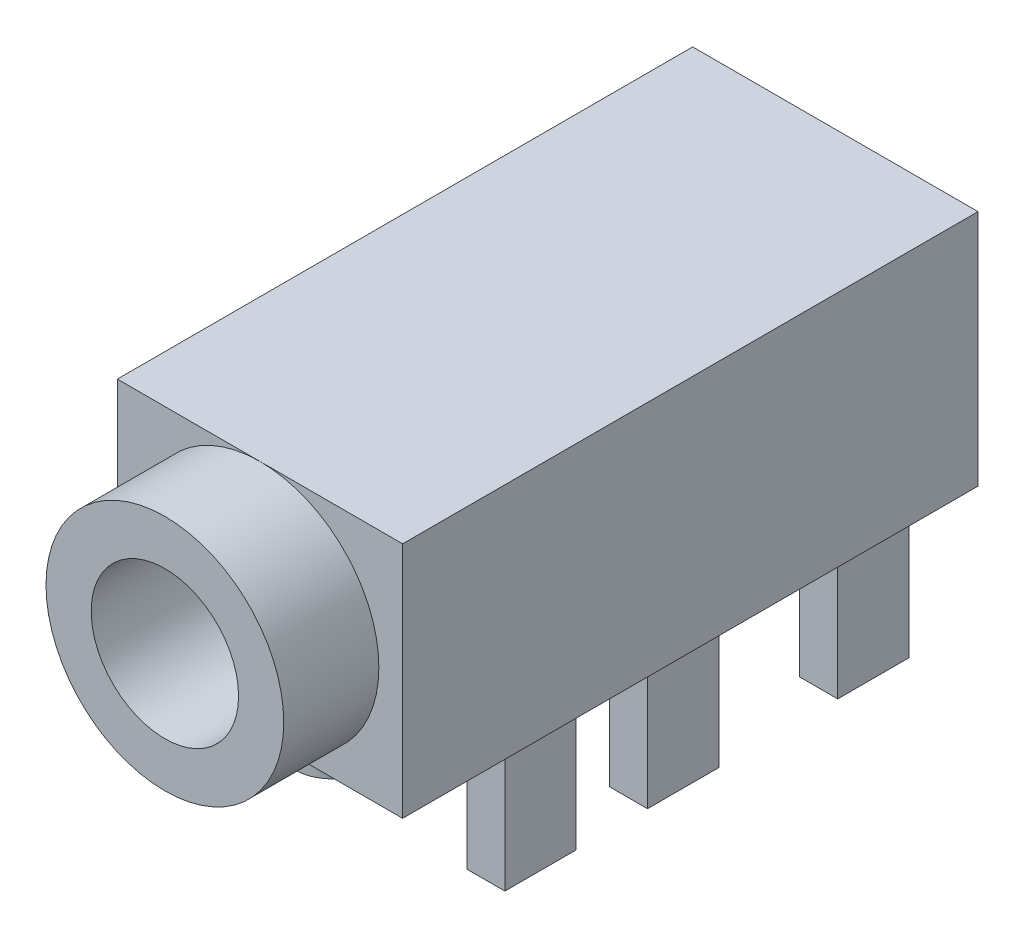
ISO-10303-21;
HEADER;
FILE_DESCRIPTION(('STEP AP214'),'2;1');
FILE_NAME('part.step','',(''),(''),'','','');
FILE_SCHEMA(('AUTOMOTIVE_DESIGN { 1 0 10303 214 1 1 1 1 }'));
ENDSEC;
DATA;
#1=APPLICATION_CONTEXT('core data for automotive mechanical design processes');
#2=APPLICATION_PROTOCOL_DEFINITION('international standard','automotive_design',2000,#1);
#3=PRODUCT_CONTEXT('',#1,'mechanical');
#4=PRODUCT('Part','Part','',(#3));
#5=PRODUCT_RELATED_PRODUCT_CATEGORY('part','',(#4));
#6=PRODUCT_DEFINITION_FORMATION('','',#4);
#7=PRODUCT_DEFINITION_CONTEXT('part definition',#1,'design');
#8=PRODUCT_DEFINITION('design','',#6,#7);
#9=PRODUCT_DEFINITION_SHAPE('','',#8);
#10=(LENGTH_UNIT() NAMED_UNIT(*) SI_UNIT(.MILLI.,.METRE.));
#11=(NAMED_UNIT(*) PLANE_ANGLE_UNIT() SI_UNIT($,.RADIAN.));
#12=(NAMED_UNIT(*) SI_UNIT($,.STERADIAN.) SOLID_ANGLE_UNIT());
#13=UNCERTAINTY_MEASURE_WITH_UNIT(LENGTH_MEASURE(1.E-05),#10,'distance_accuracy_value','');
#14=(GEOMETRIC_REPRESENTATION_CONTEXT(3) GLOBAL_UNCERTAINTY_ASSIGNED_CONTEXT((#13)) GLOBAL_UNIT_ASSIGNED_CONTEXT((#10,
#11,#12)) REPRESENTATION_CONTEXT('',''));
#15=CARTESIAN_POINT('',(0.,0.,0.));
#16=DIRECTION('',(0.,0.,1.));
#17=DIRECTION('',(1.,0.,0.));
#18=AXIS2_PLACEMENT_3D('',#15,#16,#17);
#19=CARTESIAN_POINT('',(0.,0.,0.));
#20=DIRECTION('',(0.,1.,0.));
#21=DIRECTION('',(0.,0.,1.));
#22=AXIS2_PLACEMENT_3D('',#19,#20,#21);
#23=PLANE('',#22);
#24=CARTESIAN_POINT('',(0.,0.,-2.44999999999992));
#25=DIRECTION('',(0.,1.,0.));
#26=DIRECTION('',(0.,0.,1.));
#27=AXIS2_PLACEMENT_3D('',#24,#25,#26);
#28=CIRCLE('',#27,0.75);
#29=CARTESIAN_POINT('',(0.,0.,-1.69999999999992));
#30=VERTEX_POINT('',#29);
#31=EDGE_CURVE('E11',#30,#30,#28,.F.);
#32=ORIENTED_EDGE('',*,*,#31,.F.);
#33=EDGE_LOOP('',(#32));
#34=FACE_BOUND('',#33,.T.);
#35=CARTESIAN_POINT('',(0.,0.,4.55000000000008));
#36=DIRECTION('',(0.,1.,0.));
#37=DIRECTION('',(0.,0.,1.));
#38=AXIS2_PLACEMENT_3D('',#35,#36,#37);
#39=CIRCLE('',#38,0.75);
#40=CARTESIAN_POINT('',(0.,0.,5.30000000000008));
#41=VERTEX_POINT('',#40);
#42=EDGE_CURVE('E48',#41,#41,#39,.F.);
#43=ORIENTED_EDGE('',*,*,#42,.F.);
#44=EDGE_LOOP('',(#43));
#45=FACE_BOUND('',#44,.T.);
#46=DIRECTION('',(0.,0.,-1.));
#47=VECTOR('',#46,1.);
#48=CARTESIAN_POINT('',(1.8,0.,-3.49999999999992));
#49=LINE('',#48,#47);
#50=CARTESIAN_POINT('',(1.8,0.,-3.49999999999992));
#51=VERTEX_POINT('',#50);
#52=CARTESIAN_POINT('',(1.8,0.,-4.99999999999992));
#53=VERTEX_POINT('',#52);
#54=EDGE_CURVE('E257',#51,#53,#49,.T.);
#55=ORIENTED_EDGE('',*,*,#54,.F.);
#56=DIRECTION('',(-1.,0.,0.));
#57=VECTOR('',#56,1.);
#58=CARTESIAN_POINT('',(2.6,0.,-3.49999999999992));
#59=LINE('',#58,#57);
#60=CARTESIAN_POINT('',(2.6,0.,-3.49999999999992));
#61=VERTEX_POINT('',#60);
#62=EDGE_CURVE('E273',#61,#51,#59,.T.);
#63=ORIENTED_EDGE('',*,*,#62,.F.);
#64=DIRECTION('',(0.,0.,1.));
#65=VECTOR('',#64,1.);
#66=CARTESIAN_POINT('',(2.6,0.,-3.49999999999992));
#67=LINE('',#66,#65);
#68=CARTESIAN_POINT('',(2.6,0.,-4.99999999999992));
#69=VERTEX_POINT('',#68);
#70=EDGE_CURVE('E285',#69,#61,#67,.T.);
#71=ORIENTED_EDGE('',*,*,#70,.F.);
#72=DIRECTION('',(1.,0.,0.));
#73=VECTOR('',#72,1.);
#74=CARTESIAN_POINT('',(2.6,0.,-4.99999999999992));
#75=LINE('',#74,#73);
#76=EDGE_CURVE('E69',#53,#69,#75,.T.);
#77=ORIENTED_EDGE('',*,*,#76,.F.);
#78=EDGE_LOOP('',(#55,#63,#71,#77));
#79=FACE_BOUND('',#78,.T.);
#80=DIRECTION('',(0.,0.,-1.));
#81=VECTOR('',#80,1.);
#82=CARTESIAN_POINT('',(1.8,0.,3.50000000000008));
#83=LINE('',#82,#81);
#84=CARTESIAN_POINT('',(1.8,0.,3.50000000000008));
#85=VERTEX_POINT('',#84);
#86=CARTESIAN_POINT('',(1.8,0.,2.00000000000008));
#87=VERTEX_POINT('',#86);
#88=EDGE_CURVE('E351',#85,#87,#83,.T.);
#89=ORIENTED_EDGE('',*,*,#88,.F.);
#90=DIRECTION('',(-1.,0.,0.));
#91=VECTOR('',#90,1.);
#92=CARTESIAN_POINT('',(2.6,0.,3.50000000000008));
#93=LINE('',#92,#91);
#94=CARTESIAN_POINT('',(2.6,0.,3.50000000000008));
#95=VERTEX_POINT('',#94);
#96=EDGE_CURVE('E357',#95,#85,#93,.T.);
#97=ORIENTED_EDGE('',*,*,#96,.F.);
#98=DIRECTION('',(0.,0.,1.));
#99=VECTOR('',#98,1.);
#100=CARTESIAN_POINT('',(2.6,0.,3.50000000000008));
#101=LINE('',#100,#99);
#102=CARTESIAN_POINT('',(2.6,0.,2.00000000000008));
#103=VERTEX_POINT('',#102);
#104=EDGE_CURVE('E374',#103,#95,#101,.T.);
#105=ORIENTED_EDGE('',*,*,#104,.F.);
#106=DIRECTION('',(1.,0.,0.));
#107=VECTOR('',#106,1.);
#108=CARTESIAN_POINT('',(2.6,0.,2.00000000000008));
#109=LINE('',#108,#107);
#110=EDGE_CURVE('E370',#87,#103,#109,.T.);
#111=ORIENTED_EDGE('',*,*,#110,.F.);
#112=EDGE_LOOP('',(#89,#97,#105,#111));
#113=FACE_BOUND('',#112,.T.);
#114=DIRECTION('',(0.,0.,-1.));
#115=VECTOR('',#114,1.);
#116=CARTESIAN_POINT('',(1.8,0.,0.500000000000082));
#117=LINE('',#116,#115);
#118=CARTESIAN_POINT('',(1.8,0.,0.500000000000082));
#119=VERTEX_POINT('',#118);
#120=CARTESIAN_POINT('',(1.8,0.,-0.999999999999917));
#121=VERTEX_POINT('',#120);
#122=EDGE_CURVE('E306',#119,#121,#117,.T.);
#123=ORIENTED_EDGE('',*,*,#122,.F.);
#124=DIRECTION('',(-1.,0.,0.));
#125=VECTOR('',#124,1.);
#126=CARTESIAN_POINT('',(2.6,0.,0.500000000000082));
#127=LINE('',#126,#125);
#128=CARTESIAN_POINT('',(2.6,0.,0.500000000000082));
#129=VERTEX_POINT('',#128);
#130=EDGE_CURVE('E312',#129,#119,#127,.T.);
#131=ORIENTED_EDGE('',*,*,#130,.F.);
#132=DIRECTION('',(0.,0.,1.));
#133=VECTOR('',#132,1.);
#134=CARTESIAN_POINT('',(2.6,0.,0.500000000000082));
#135=LINE('',#134,#133);
#136=CARTESIAN_POINT('',(2.6,0.,-0.999999999999917));
#137=VERTEX_POINT('',#136);
#138=EDGE_CURVE('E329',#137,#129,#135,.T.);
#139=ORIENTED_EDGE('',*,*,#138,.F.);
#140=DIRECTION('',(1.,0.,0.));
#141=VECTOR('',#140,1.);
#142=CARTESIAN_POINT('',(2.6,0.,-0.999999999999917));
#143=LINE('',#142,#141);
#144=EDGE_CURVE('E325',#121,#137,#143,.T.);
#145=ORIENTED_EDGE('',*,*,#144,.F.);
#146=EDGE_LOOP('',(#123,#131,#139,#145));
#147=FACE_BOUND('',#146,.T.);
#148=DIRECTION('',(0.,0.,-1.));
#149=VECTOR('',#148,1.);
#150=CARTESIAN_POINT('',(-2.6,0.,-4.79999999999992));
#151=LINE('',#150,#149);
#152=CARTESIAN_POINT('',(-2.6,0.,-4.79999999999992));
#153=VERTEX_POINT('',#152);
#154=CARTESIAN_POINT('',(-2.6,0.,-6.04999999999992));
#155=VERTEX_POINT('',#154);
#156=EDGE_CURVE('E58',#153,#155,#151,.T.);
#157=ORIENTED_EDGE('',*,*,#156,.F.);
#158=DIRECTION('',(-1.,0.,0.));
#159=VECTOR('',#158,1.);
#160=CARTESIAN_POINT('',(-1.8,0.,-4.79999999999992));
#161=LINE('',#160,#159);
#162=CARTESIAN_POINT('',(-1.8,0.,-4.79999999999992));
#163=VERTEX_POINT('',#162);
#164=EDGE_CURVE('E251',#163,#153,#161,.T.);
#165=ORIENTED_EDGE('',*,*,#164,.F.);
#166=DIRECTION('',(0.,0.,1.));
#167=VECTOR('',#166,1.);
#168=CARTESIAN_POINT('',(-1.8,0.,-4.79999999999992));
#169=LINE('',#168,#167);
#170=CARTESIAN_POINT('',(-1.8,0.,-6.04999999999992));
#171=VERTEX_POINT('',#170);
#172=EDGE_CURVE('E496',#171,#163,#169,.T.);
#173=ORIENTED_EDGE('',*,*,#172,.F.);
#174=DIRECTION('',(-1.,0.,0.));
#175=VECTOR('',#174,1.);
#176=CARTESIAN_POINT('',(-3.,0.,-6.04999999999992));
#177=LINE('',#176,#175);
#178=CARTESIAN_POINT('',(2.99999999999999,0.,-6.04999999999992));
#179=VERTEX_POINT('',#178);
#180=EDGE_CURVE('E426',#179,#171,#177,.T.);
#181=ORIENTED_EDGE('',*,*,#180,.F.);
#182=DIRECTION('',(0.,0.,-1.));
#183=VECTOR('',#182,1.);
#184=CARTESIAN_POINT('',(2.99999999999999,0.,-6.04999999999992));
#185=LINE('',#184,#183);
#186=CARTESIAN_POINT('',(3.,0.,6.05000000000008));
#187=VERTEX_POINT('',#186);
#188=EDGE_CURVE('E401',#187,#179,#185,.T.);
#189=ORIENTED_EDGE('',*,*,#188,.F.);
#190=DIRECTION('',(1.,0.,0.));
#191=VECTOR('',#190,1.);
#192=CARTESIAN_POINT('',(-3.,0.,6.05000000000008));
#193=LINE('',#192,#191);
#194=CARTESIAN_POINT('',(0.,0.,6.05000000000008));
#195=VERTEX_POINT('',#194);
#196=EDGE_CURVE('E434',#195,#187,#193,.T.);
#197=ORIENTED_EDGE('',*,*,#196,.F.);
#198=CARTESIAN_POINT('',(-3.,0.,6.05000000000008));
#199=VERTEX_POINT('',#198);
#200=EDGE_CURVE('E411',#199,#195,#193,.T.);
#201=ORIENTED_EDGE('',*,*,#200,.F.);
#202=DIRECTION('',(0.,0.,1.));
#203=VECTOR('',#202,1.);
#204=CARTESIAN_POINT('',(-3.,0.,-6.04999999999992));
#205=LINE('',#204,#203);
#206=CARTESIAN_POINT('',(-3.,0.,-6.04999999999992));
#207=VERTEX_POINT('',#206);
#208=EDGE_CURVE('E430',#207,#199,#205,.T.);
#209=ORIENTED_EDGE('',*,*,#208,.F.);
#210=EDGE_CURVE('E425',#155,#207,#177,.T.);
#211=ORIENTED_EDGE('',*,*,#210,.F.);
#212=EDGE_LOOP('',(#157,#165,#173,#181,#189,#197,#201,#209,#211));
#213=FACE_BOUND('',#212,.T.);
#214=ADVANCED_FACE('F39',(#34,#45,#79,#113,#147,#213),#23,.F.);
#215=CARTESIAN_POINT('',(-3.,5.,6.05000000000008));
#216=DIRECTION('',(0.,0.,-1.));
#217=DIRECTION('',(-1.,0.,0.));
#218=AXIS2_PLACEMENT_3D('',#215,#216,#217);
#219=PLANE('',#218);
#220=CARTESIAN_POINT('',(0.,2.5,6.05000000000008));
#221=DIRECTION('',(0.,0.,1.));
#222=DIRECTION('',(1.,0.,0.));
#223=AXIS2_PLACEMENT_3D('',#220,#221,#222);
#224=CIRCLE('',#223,2.5);
#225=CARTESIAN_POINT('',(0.,5.,6.05000000000008));
#226=VERTEX_POINT('',#225);
#227=EDGE_CURVE('E396',#226,#195,#224,.T.);
#228=ORIENTED_EDGE('',*,*,#227,.F.);
#229=DIRECTION('',(1.,0.,0.));
#230=VECTOR('',#229,1.);
#231=CARTESIAN_POINT('',(-3.,5.,6.05000000000008));
#232=LINE('',#231,#230);
#233=CARTESIAN_POINT('',(-3.,5.,6.05000000000008));
#234=VERTEX_POINT('',#233);
#235=EDGE_CURVE('E418',#234,#226,#232,.T.);
#236=ORIENTED_EDGE('',*,*,#235,.F.);
#237=DIRECTION('',(0.,-1.,0.));
#238=VECTOR('',#237,1.);
#239=CARTESIAN_POINT('',(-3.,5.,6.05000000000008));
#240=LINE('',#239,#238);
#241=EDGE_CURVE('E441',#234,#199,#240,.T.);
#242=ORIENTED_EDGE('',*,*,#241,.T.);
#243=ORIENTED_EDGE('',*,*,#200,.T.);
#244=EDGE_LOOP('',(#228,#236,#242,#243));
#245=FACE_BOUND('',#244,.T.);
#246=ADVANCED_FACE('F472',(#245),#219,.F.);
#247=CARTESIAN_POINT('',(2.99999999999999,5.,-6.04999999999992));
#248=DIRECTION('',(-1.,0.,0.));
#249=DIRECTION('',(0.,0.,1.));
#250=AXIS2_PLACEMENT_3D('',#247,#248,#249);
#251=PLANE('',#250);
#252=ORIENTED_EDGE('',*,*,#188,.T.);
#253=DIRECTION('',(0.,-1.,0.));
#254=VECTOR('',#253,1.);
#255=CARTESIAN_POINT('',(2.99999999999999,5.,-6.04999999999992));
#256=LINE('',#255,#254);
#257=CARTESIAN_POINT('',(2.99999999999999,5.,-6.04999999999992));
#258=VERTEX_POINT('',#257);
#259=EDGE_CURVE('E448',#258,#179,#256,.T.);
#260=ORIENTED_EDGE('',*,*,#259,.F.);
#261=DIRECTION('',(0.,0.,-1.));
#262=VECTOR('',#261,1.);
#263=CARTESIAN_POINT('',(2.99999999999999,5.,-6.04999999999992));
#264=LINE('',#263,#262);
#265=CARTESIAN_POINT('',(3.,5.,6.05000000000008));
#266=VERTEX_POINT('',#265);
#267=EDGE_CURVE('E406',#266,#258,#264,.T.);
#268=ORIENTED_EDGE('',*,*,#267,.F.);
#269=DIRECTION('',(0.,-1.,0.));
#270=VECTOR('',#269,1.);
#271=CARTESIAN_POINT('',(3.,5.,6.05000000000008));
#272=LINE('',#271,#270);
#273=EDGE_CURVE('E421',#266,#187,#272,.T.);
#274=ORIENTED_EDGE('',*,*,#273,.T.);
#275=EDGE_LOOP('',(#252,#260,#268,#274));
#276=FACE_BOUND('',#275,.T.);
#277=ADVANCED_FACE('F41',(#276),#251,.F.);
#278=CARTESIAN_POINT('',(-3.,5.,-6.04999999999992));
#279=DIRECTION('',(0.,0.,1.));
#280=DIRECTION('',(1.,0.,0.));
#281=AXIS2_PLACEMENT_3D('',#278,#279,#280);
#282=PLANE('',#281);
#283=ORIENTED_EDGE('',*,*,#180,.T.);
#284=EDGE_CURVE('E431',#171,#155,#177,.T.);
#285=ORIENTED_EDGE('',*,*,#284,.T.);
#286=ORIENTED_EDGE('',*,*,#210,.T.);
#287=DIRECTION('',(0.,-1.,0.));
#288=VECTOR('',#287,1.);
#289=CARTESIAN_POINT('',(-3.,5.,-6.04999999999992));
#290=LINE('',#289,#288);
#291=CARTESIAN_POINT('',(-3.,5.,-6.04999999999992));
#292=VERTEX_POINT('',#291);
#293=EDGE_CURVE('E444',#292,#207,#290,.T.);
#294=ORIENTED_EDGE('',*,*,#293,.F.);
#295=DIRECTION('',(-1.,0.,0.));
#296=VECTOR('',#295,1.);
#297=CARTESIAN_POINT('',(-3.,5.,-6.04999999999992));
#298=LINE('',#297,#296);
#299=EDGE_CURVE('E410',#258,#292,#298,.T.);
#300=ORIENTED_EDGE('',*,*,#299,.F.);
#301=ORIENTED_EDGE('',*,*,#259,.T.);
#302=EDGE_LOOP('',(#283,#285,#286,#294,#300,#301));
#303=FACE_BOUND('',#302,.T.);
#304=ADVANCED_FACE('F484',(#303),#282,.F.);
#305=CARTESIAN_POINT('',(-3.,5.,-6.04999999999992));
#306=DIRECTION('',(1.,0.,0.));
#307=DIRECTION('',(0.,0.,-1.));
#308=AXIS2_PLACEMENT_3D('',#305,#306,#307);
#309=PLANE('',#308);
#310=ORIENTED_EDGE('',*,*,#208,.T.);
#311=ORIENTED_EDGE('',*,*,#241,.F.);
#312=DIRECTION('',(0.,0.,1.));
#313=VECTOR('',#312,1.);
#314=CARTESIAN_POINT('',(-3.,5.,-6.04999999999992));
#315=LINE('',#314,#313);
#316=EDGE_CURVE('E414',#292,#234,#315,.T.);
#317=ORIENTED_EDGE('',*,*,#316,.F.);
#318=ORIENTED_EDGE('',*,*,#293,.T.);
#319=EDGE_LOOP('',(#310,#311,#317,#318));
#320=FACE_BOUND('',#319,.T.);
#321=ADVANCED_FACE('F477',(#320),#309,.F.);
#322=EDGE_CURVE('E405',#195,#226,#224,.T.);
#323=ORIENTED_EDGE('',*,*,#322,.F.);
#324=ORIENTED_EDGE('',*,*,#196,.T.);
#325=ORIENTED_EDGE('',*,*,#273,.F.);
#326=EDGE_CURVE('E417',#226,#266,#232,.T.);
#327=ORIENTED_EDGE('',*,*,#326,.F.);
#328=EDGE_LOOP('',(#323,#324,#325,#327));
#329=FACE_BOUND('',#328,.T.);
#330=ADVANCED_FACE('F464',(#329),#219,.F.);
#331=CARTESIAN_POINT('',(0.,5.,0.));
#332=DIRECTION('',(0.,1.,0.));
#333=DIRECTION('',(0.,0.,1.));
#334=AXIS2_PLACEMENT_3D('',#331,#332,#333);
#335=PLANE('',#334);
#336=ORIENTED_EDGE('',*,*,#267,.T.);
#337=ORIENTED_EDGE('',*,*,#299,.T.);
#338=ORIENTED_EDGE('',*,*,#316,.T.);
#339=ORIENTED_EDGE('',*,*,#235,.T.);
#340=ORIENTED_EDGE('',*,*,#326,.T.);
#341=EDGE_LOOP('',(#336,#337,#338,#339,#340));
#342=FACE_BOUND('',#341,.T.);
#343=ADVANCED_FACE('F547',(#342),#335,.T.);
#344=CARTESIAN_POINT('',(0.,2.5,8.05000000000008));
#345=DIRECTION('',(0.,0.,-1.));
#346=DIRECTION('',(-1.,0.,0.));
#347=AXIS2_PLACEMENT_3D('',#344,#345,#346);
#348=CYLINDRICAL_SURFACE('',#347,2.5);
#349=CARTESIAN_POINT('',(0.,2.5,8.05000000000008));
#350=DIRECTION('',(0.,0.,1.));
#351=DIRECTION('',(1.,0.,0.));
#352=AXIS2_PLACEMENT_3D('',#349,#350,#351);
#353=CIRCLE('',#352,2.5);
#354=CARTESIAN_POINT('',(2.5,2.5,8.05000000000008));
#355=VERTEX_POINT('',#354);
#356=EDGE_CURVE('E397',#355,#355,#353,.T.);
#357=ORIENTED_EDGE('',*,*,#356,.F.);
#358=EDGE_LOOP('',(#357));
#359=FACE_BOUND('',#358,.T.);
#360=ORIENTED_EDGE('',*,*,#227,.T.);
#361=ORIENTED_EDGE('',*,*,#322,.T.);
#362=EDGE_LOOP('',(#360,#361));
#363=FACE_BOUND('',#362,.T.);
#364=ADVANCED_FACE('F459',(#359,#363),#348,.T.);
#365=CARTESIAN_POINT('',(0.,2.5,8.05000000000008));
#366=DIRECTION('',(0.,0.,1.));
#367=DIRECTION('',(1.,0.,0.));
#368=AXIS2_PLACEMENT_3D('',#365,#366,#367);
#369=PLANE('',#368);
#370=CARTESIAN_POINT('',(0.,2.5,8.05000000000008));
#371=DIRECTION('',(0.,0.,1.));
#372=DIRECTION('',(1.,0.,0.));
#373=AXIS2_PLACEMENT_3D('',#370,#371,#372);
#374=CIRCLE('',#373,1.55);
#375=CARTESIAN_POINT('',(1.55,2.5,8.05000000000008));
#376=VERTEX_POINT('',#375);
#377=EDGE_CURVE('E529',#376,#376,#374,.T.);
#378=ORIENTED_EDGE('',*,*,#377,.F.);
#379=EDGE_LOOP('',(#378));
#380=FACE_BOUND('',#379,.T.);
#381=ORIENTED_EDGE('',*,*,#356,.T.);
#382=EDGE_LOOP('',(#381));
#383=FACE_BOUND('',#382,.T.);
#384=ADVANCED_FACE('F539',(#380,#383),#369,.T.);
#385=CARTESIAN_POINT('',(1.8,-2.8,3.50000000000008));
#386=DIRECTION('',(1.,0.,0.));
#387=DIRECTION('',(0.,0.,-1.));
#388=AXIS2_PLACEMENT_3D('',#385,#386,#387);
#389=PLANE('',#388);
#390=ORIENTED_EDGE('',*,*,#88,.T.);
#391=DIRECTION('',(0.,1.,0.));
#392=VECTOR('',#391,1.);
#393=CARTESIAN_POINT('',(1.8,-2.8,2.00000000000008));
#394=LINE('',#393,#392);
#395=CARTESIAN_POINT('',(1.8,-2.8,2.00000000000008));
#396=VERTEX_POINT('',#395);
#397=EDGE_CURVE('E392',#396,#87,#394,.T.);
#398=ORIENTED_EDGE('',*,*,#397,.F.);
#399=DIRECTION('',(0.,0.,-1.));
#400=VECTOR('',#399,1.);
#401=CARTESIAN_POINT('',(1.8,-2.8,3.50000000000008));
#402=LINE('',#401,#400);
#403=CARTESIAN_POINT('',(1.8,-2.8,3.50000000000008));
#404=VERTEX_POINT('',#403);
#405=EDGE_CURVE('E352',#404,#396,#402,.T.);
#406=ORIENTED_EDGE('',*,*,#405,.F.);
#407=DIRECTION('',(0.,1.,0.));
#408=VECTOR('',#407,1.);
#409=CARTESIAN_POINT('',(1.8,-2.8,3.50000000000008));
#410=LINE('',#409,#408);
#411=EDGE_CURVE('E366',#404,#85,#410,.T.);
#412=ORIENTED_EDGE('',*,*,#411,.T.);
#413=EDGE_LOOP('',(#390,#398,#406,#412));
#414=FACE_BOUND('',#413,.T.);
#415=ADVANCED_FACE('F542',(#414),#389,.F.);
#416=CARTESIAN_POINT('',(2.6,-2.8,2.00000000000008));
#417=DIRECTION('',(0.,0.,1.));
#418=DIRECTION('',(1.,0.,0.));
#419=AXIS2_PLACEMENT_3D('',#416,#417,#418);
#420=PLANE('',#419);
#421=ORIENTED_EDGE('',*,*,#110,.T.);
#422=DIRECTION('',(0.,1.,0.));
#423=VECTOR('',#422,1.);
#424=CARTESIAN_POINT('',(2.6,-2.8,2.00000000000008));
#425=LINE('',#424,#423);
#426=CARTESIAN_POINT('',(2.6,-2.8,2.00000000000008));
#427=VERTEX_POINT('',#426);
#428=EDGE_CURVE('E388',#427,#103,#425,.T.);
#429=ORIENTED_EDGE('',*,*,#428,.F.);
#430=DIRECTION('',(1.,0.,0.));
#431=VECTOR('',#430,1.);
#432=CARTESIAN_POINT('',(2.6,-2.8,2.00000000000008));
#433=LINE('',#432,#431);
#434=EDGE_CURVE('E356',#396,#427,#433,.T.);
#435=ORIENTED_EDGE('',*,*,#434,.F.);
#436=ORIENTED_EDGE('',*,*,#397,.T.);
#437=EDGE_LOOP('',(#421,#429,#435,#436));
#438=FACE_BOUND('',#437,.T.);
#439=ADVANCED_FACE('F612',(#438),#420,.F.);
#440=CARTESIAN_POINT('',(2.6,-2.8,3.50000000000008));
#441=DIRECTION('',(-1.,0.,0.));
#442=DIRECTION('',(0.,0.,1.));
#443=AXIS2_PLACEMENT_3D('',#440,#441,#442);
#444=PLANE('',#443);
#445=ORIENTED_EDGE('',*,*,#104,.T.);
#446=DIRECTION('',(0.,1.,0.));
#447=VECTOR('',#446,1.);
#448=CARTESIAN_POINT('',(2.6,-2.8,3.50000000000008));
#449=LINE('',#448,#447);
#450=CARTESIAN_POINT('',(2.6,-2.8,3.50000000000008));
#451=VERTEX_POINT('',#450);
#452=EDGE_CURVE('E384',#451,#95,#449,.T.);
#453=ORIENTED_EDGE('',*,*,#452,.F.);
#454=DIRECTION('',(0.,0.,1.));
#455=VECTOR('',#454,1.);
#456=CARTESIAN_POINT('',(2.6,-2.8,3.50000000000008));
#457=LINE('',#456,#455);
#458=EDGE_CURVE('E360',#427,#451,#457,.T.);
#459=ORIENTED_EDGE('',*,*,#458,.F.);
#460=ORIENTED_EDGE('',*,*,#428,.T.);
#461=EDGE_LOOP('',(#445,#453,#459,#460));
#462=FACE_BOUND('',#461,.T.);
#463=ADVANCED_FACE('F623',(#462),#444,.F.);
#464=CARTESIAN_POINT('',(2.6,-2.8,3.50000000000008));
#465=DIRECTION('',(0.,0.,-1.));
#466=DIRECTION('',(-1.,0.,0.));
#467=AXIS2_PLACEMENT_3D('',#464,#465,#466);
#468=PLANE('',#467);
#469=ORIENTED_EDGE('',*,*,#96,.T.);
#470=ORIENTED_EDGE('',*,*,#411,.F.);
#471=DIRECTION('',(-1.,0.,0.));
#472=VECTOR('',#471,1.);
#473=CARTESIAN_POINT('',(2.6,-2.8,3.50000000000008));
#474=LINE('',#473,#472);
#475=EDGE_CURVE('E363',#451,#404,#474,.T.);
#476=ORIENTED_EDGE('',*,*,#475,.F.);
#477=ORIENTED_EDGE('',*,*,#452,.T.);
#478=EDGE_LOOP('',(#469,#470,#476,#477));
#479=FACE_BOUND('',#478,.T.);
#480=ADVANCED_FACE('F633',(#479),#468,.F.);
#481=CARTESIAN_POINT('',(0.,-2.8,0.));
#482=DIRECTION('',(0.,1.,0.));
#483=DIRECTION('',(0.,0.,1.));
#484=AXIS2_PLACEMENT_3D('',#481,#482,#483);
#485=PLANE('',#484);
#486=ORIENTED_EDGE('',*,*,#405,.T.);
#487=ORIENTED_EDGE('',*,*,#434,.T.);
#488=ORIENTED_EDGE('',*,*,#458,.T.);
#489=ORIENTED_EDGE('',*,*,#475,.T.);
#490=EDGE_LOOP('',(#486,#487,#488,#489));
#491=FACE_BOUND('',#490,.T.);
#492=ADVANCED_FACE('F643',(#491),#485,.F.);
#493=CARTESIAN_POINT('',(1.8,-2.8,0.500000000000082));
#494=DIRECTION('',(1.,0.,0.));
#495=DIRECTION('',(0.,0.,-1.));
#496=AXIS2_PLACEMENT_3D('',#493,#494,#495);
#497=PLANE('',#496);
#498=ORIENTED_EDGE('',*,*,#122,.T.);
#499=DIRECTION('',(0.,1.,0.));
#500=VECTOR('',#499,1.);
#501=CARTESIAN_POINT('',(1.8,-2.8,-0.999999999999917));
#502=LINE('',#501,#500);
#503=CARTESIAN_POINT('',(1.8,-2.8,-0.999999999999917));
#504=VERTEX_POINT('',#503);
#505=EDGE_CURVE('E347',#504,#121,#502,.T.);
#506=ORIENTED_EDGE('',*,*,#505,.F.);
#507=DIRECTION('',(0.,0.,-1.));
#508=VECTOR('',#507,1.);
#509=CARTESIAN_POINT('',(1.8,-2.8,0.500000000000082));
#510=LINE('',#509,#508);
#511=CARTESIAN_POINT('',(1.8,-2.8,0.500000000000082));
#512=VERTEX_POINT('',#511);
#513=EDGE_CURVE('E307',#512,#504,#510,.T.);
#514=ORIENTED_EDGE('',*,*,#513,.F.);
#515=DIRECTION('',(0.,1.,0.));
#516=VECTOR('',#515,1.);
#517=CARTESIAN_POINT('',(1.8,-2.8,0.500000000000082));
#518=LINE('',#517,#516);
#519=EDGE_CURVE('E321',#512,#119,#518,.T.);
#520=ORIENTED_EDGE('',*,*,#519,.T.);
#521=EDGE_LOOP('',(#498,#506,#514,#520));
#522=FACE_BOUND('',#521,.T.);
#523=ADVANCED_FACE('F653',(#522),#497,.F.);
#524=CARTESIAN_POINT('',(2.6,-2.8,-0.999999999999917));
#525=DIRECTION('',(0.,0.,1.));
#526=DIRECTION('',(1.,0.,0.));
#527=AXIS2_PLACEMENT_3D('',#524,#525,#526);
#528=PLANE('',#527);
#529=ORIENTED_EDGE('',*,*,#144,.T.);
#530=DIRECTION('',(0.,1.,0.));
#531=VECTOR('',#530,1.);
#532=CARTESIAN_POINT('',(2.6,-2.8,-0.999999999999917));
#533=LINE('',#532,#531);
#534=CARTESIAN_POINT('',(2.6,-2.8,-0.999999999999917));
#535=VERTEX_POINT('',#534);
#536=EDGE_CURVE('E343',#535,#137,#533,.T.);
#537=ORIENTED_EDGE('',*,*,#536,.F.);
#538=DIRECTION('',(1.,0.,0.));
#539=VECTOR('',#538,1.);
#540=CARTESIAN_POINT('',(2.6,-2.8,-0.999999999999917));
#541=LINE('',#540,#539);
#542=EDGE_CURVE('E311',#504,#535,#541,.T.);
#543=ORIENTED_EDGE('',*,*,#542,.F.);
#544=ORIENTED_EDGE('',*,*,#505,.T.);
#545=EDGE_LOOP('',(#529,#537,#543,#544));
#546=FACE_BOUND('',#545,.T.);
#547=ADVANCED_FACE('F663',(#546),#528,.F.);
#548=CARTESIAN_POINT('',(2.6,-2.8,0.500000000000082));
#549=DIRECTION('',(-1.,0.,0.));
#550=DIRECTION('',(0.,0.,1.));
#551=AXIS2_PLACEMENT_3D('',#548,#549,#550);
#552=PLANE('',#551);
#553=ORIENTED_EDGE('',*,*,#138,.T.);
#554=DIRECTION('',(0.,1.,0.));
#555=VECTOR('',#554,1.);
#556=CARTESIAN_POINT('',(2.6,-2.8,0.500000000000082));
#557=LINE('',#556,#555);
#558=CARTESIAN_POINT('',(2.6,-2.8,0.500000000000082));
#559=VERTEX_POINT('',#558);
#560=EDGE_CURVE('E339',#559,#129,#557,.T.);
#561=ORIENTED_EDGE('',*,*,#560,.F.);
#562=DIRECTION('',(0.,0.,1.));
#563=VECTOR('',#562,1.);
#564=CARTESIAN_POINT('',(2.6,-2.8,0.500000000000082));
#565=LINE('',#564,#563);
#566=EDGE_CURVE('E315',#535,#559,#565,.T.);
#567=ORIENTED_EDGE('',*,*,#566,.F.);
#568=ORIENTED_EDGE('',*,*,#536,.T.);
#569=EDGE_LOOP('',(#553,#561,#567,#568));
#570=FACE_BOUND('',#569,.T.);
#571=ADVANCED_FACE('F673',(#570),#552,.F.);
#572=CARTESIAN_POINT('',(2.6,-2.8,0.500000000000082));
#573=DIRECTION('',(0.,0.,-1.));
#574=DIRECTION('',(-1.,0.,0.));
#575=AXIS2_PLACEMENT_3D('',#572,#573,#574);
#576=PLANE('',#575);
#577=ORIENTED_EDGE('',*,*,#130,.T.);
#578=ORIENTED_EDGE('',*,*,#519,.F.);
#579=DIRECTION('',(-1.,0.,0.));
#580=VECTOR('',#579,1.);
#581=CARTESIAN_POINT('',(2.6,-2.8,0.500000000000082));
#582=LINE('',#581,#580);
#583=EDGE_CURVE('E318',#559,#512,#582,.T.);
#584=ORIENTED_EDGE('',*,*,#583,.F.);
#585=ORIENTED_EDGE('',*,*,#560,.T.);
#586=EDGE_LOOP('',(#577,#578,#584,#585));
#587=FACE_BOUND('',#586,.T.);
#588=ADVANCED_FACE('F683',(#587),#576,.F.);
#589=CARTESIAN_POINT('',(0.,-2.8,0.));
#590=DIRECTION('',(0.,1.,0.));
#591=DIRECTION('',(0.,0.,1.));
#592=AXIS2_PLACEMENT_3D('',#589,#590,#591);
#593=PLANE('',#592);
#594=ORIENTED_EDGE('',*,*,#513,.T.);
#595=ORIENTED_EDGE('',*,*,#542,.T.);
#596=ORIENTED_EDGE('',*,*,#566,.T.);
#597=ORIENTED_EDGE('',*,*,#583,.T.);
#598=EDGE_LOOP('',(#594,#595,#596,#597));
#599=FACE_BOUND('',#598,.T.);
#600=ADVANCED_FACE('F693',(#599),#593,.F.);
#601=CARTESIAN_POINT('',(1.8,-2.8,-3.49999999999992));
#602=DIRECTION('',(1.,0.,0.));
#603=DIRECTION('',(0.,0.,-1.));
#604=AXIS2_PLACEMENT_3D('',#601,#602,#603);
#605=PLANE('',#604);
#606=ORIENTED_EDGE('',*,*,#54,.T.);
#607=DIRECTION('',(0.,1.,0.));
#608=VECTOR('',#607,1.);
#609=CARTESIAN_POINT('',(1.8,-2.8,-4.99999999999992));
#610=LINE('',#609,#608);
#611=CARTESIAN_POINT('',(1.8,-2.8,-4.99999999999992));
#612=VERTEX_POINT('',#611);
#613=EDGE_CURVE('E303',#612,#53,#610,.T.);
#614=ORIENTED_EDGE('',*,*,#613,.F.);
#615=DIRECTION('',(0.,0.,-1.));
#616=VECTOR('',#615,1.);
#617=CARTESIAN_POINT('',(1.8,-2.8,-3.49999999999992));
#618=LINE('',#617,#616);
#619=CARTESIAN_POINT('',(1.8,-2.8,-3.49999999999992));
#620=VERTEX_POINT('',#619);
#621=EDGE_CURVE('E268',#620,#612,#618,.T.);
#622=ORIENTED_EDGE('',*,*,#621,.F.);
#623=DIRECTION('',(0.,1.,0.));
#624=VECTOR('',#623,1.);
#625=CARTESIAN_POINT('',(1.8,-2.8,-3.49999999999992));
#626=LINE('',#625,#624);
#627=EDGE_CURVE('E281',#620,#51,#626,.T.);
#628=ORIENTED_EDGE('',*,*,#627,.T.);
#629=EDGE_LOOP('',(#606,#614,#622,#628));
#630=FACE_BOUND('',#629,.T.);
#631=ADVANCED_FACE('F703',(#630),#605,.F.);
#632=CARTESIAN_POINT('',(2.6,-2.8,-4.99999999999992));
#633=DIRECTION('',(0.,0.,1.));
#634=DIRECTION('',(1.,0.,0.));
#635=AXIS2_PLACEMENT_3D('',#632,#633,#634);
#636=PLANE('',#635);
#637=ORIENTED_EDGE('',*,*,#76,.T.);
#638=DIRECTION('',(0.,1.,0.));
#639=VECTOR('',#638,1.);
#640=CARTESIAN_POINT('',(2.6,-2.8,-4.99999999999992));
#641=LINE('',#640,#639);
#642=CARTESIAN_POINT('',(2.6,-2.8,-4.99999999999992));
#643=VERTEX_POINT('',#642);
#644=EDGE_CURVE('E299',#643,#69,#641,.T.);
#645=ORIENTED_EDGE('',*,*,#644,.F.);
#646=DIRECTION('',(1.,0.,0.));
#647=VECTOR('',#646,1.);
#648=CARTESIAN_POINT('',(2.6,-2.8,-4.99999999999992));
#649=LINE('',#648,#647);
#650=EDGE_CURVE('E272',#612,#643,#649,.T.);
#651=ORIENTED_EDGE('',*,*,#650,.F.);
#652=ORIENTED_EDGE('',*,*,#613,.T.);
#653=EDGE_LOOP('',(#637,#645,#651,#652));
#654=FACE_BOUND('',#653,.T.);
#655=ADVANCED_FACE('F713',(#654),#636,.F.);
#656=CARTESIAN_POINT('',(2.6,-2.8,-3.49999999999992));
#657=DIRECTION('',(-1.,0.,0.));
#658=DIRECTION('',(0.,0.,1.));
#659=AXIS2_PLACEMENT_3D('',#656,#657,#658);
#660=PLANE('',#659);
#661=ORIENTED_EDGE('',*,*,#70,.T.);
#662=DIRECTION('',(0.,1.,0.));
#663=VECTOR('',#662,1.);
#664=CARTESIAN_POINT('',(2.6,-2.8,-3.49999999999992));
#665=LINE('',#664,#663);
#666=CARTESIAN_POINT('',(2.6,-2.8,-3.49999999999992));
#667=VERTEX_POINT('',#666);
#668=EDGE_CURVE('E295',#667,#61,#665,.T.);
#669=ORIENTED_EDGE('',*,*,#668,.F.);
#670=DIRECTION('',(0.,0.,1.));
#671=VECTOR('',#670,1.);
#672=CARTESIAN_POINT('',(2.6,-2.8,-3.49999999999992));
#673=LINE('',#672,#671);
#674=EDGE_CURVE('E276',#643,#667,#673,.T.);
#675=ORIENTED_EDGE('',*,*,#674,.F.);
#676=ORIENTED_EDGE('',*,*,#644,.T.);
#677=EDGE_LOOP('',(#661,#669,#675,#676));
#678=FACE_BOUND('',#677,.T.);
#679=ADVANCED_FACE('F723',(#678),#660,.F.);
#680=CARTESIAN_POINT('',(2.6,-2.8,-3.49999999999992));
#681=DIRECTION('',(0.,0.,-1.));
#682=DIRECTION('',(-1.,0.,0.));
#683=AXIS2_PLACEMENT_3D('',#680,#681,#682);
#684=PLANE('',#683);
#685=ORIENTED_EDGE('',*,*,#62,.T.);
#686=ORIENTED_EDGE('',*,*,#627,.F.);
#687=DIRECTION('',(-1.,0.,0.));
#688=VECTOR('',#687,1.);
#689=CARTESIAN_POINT('',(2.6,-2.8,-3.49999999999992));
#690=LINE('',#689,#688);
#691=EDGE_CURVE('E279',#667,#620,#690,.T.);
#692=ORIENTED_EDGE('',*,*,#691,.F.);
#693=ORIENTED_EDGE('',*,*,#668,.T.);
#694=EDGE_LOOP('',(#685,#686,#692,#693));
#695=FACE_BOUND('',#694,.T.);
#696=ADVANCED_FACE('F733',(#695),#684,.F.);
#697=CARTESIAN_POINT('',(0.,-2.8,0.));
#698=DIRECTION('',(0.,1.,0.));
#699=DIRECTION('',(0.,0.,1.));
#700=AXIS2_PLACEMENT_3D('',#697,#698,#699);
#701=PLANE('',#700);
#702=ORIENTED_EDGE('',*,*,#621,.T.);
#703=ORIENTED_EDGE('',*,*,#650,.T.);
#704=ORIENTED_EDGE('',*,*,#674,.T.);
#705=ORIENTED_EDGE('',*,*,#691,.T.);
#706=EDGE_LOOP('',(#702,#703,#704,#705));
#707=FACE_BOUND('',#706,.T.);
#708=ADVANCED_FACE('F743',(#707),#701,.F.);
#709=CARTESIAN_POINT('',(0.,0.,0.));
#710=DIRECTION('',(0.,1.,0.));
#711=DIRECTION('',(0.,0.,1.));
#712=AXIS2_PLACEMENT_3D('',#709,#710,#711);
#713=PLANE('',#712);
#714=ORIENTED_EDGE('',*,*,#284,.F.);
#715=CARTESIAN_POINT('',(-1.8,0.,-6.29999999999992));
#716=VERTEX_POINT('',#715);
#717=EDGE_CURVE('E513',#716,#171,#169,.T.);
#718=ORIENTED_EDGE('',*,*,#717,.F.);
#719=DIRECTION('',(1.,0.,0.));
#720=VECTOR('',#719,1.);
#721=CARTESIAN_POINT('',(-1.8,0.,-6.29999999999992));
#722=LINE('',#721,#720);
#723=CARTESIAN_POINT('',(-2.6,0.,-6.29999999999992));
#724=VERTEX_POINT('',#723);
#725=EDGE_CURVE('E490',#724,#716,#722,.T.);
#726=ORIENTED_EDGE('',*,*,#725,.F.);
#727=EDGE_CURVE('E254',#155,#724,#151,.T.);
#728=ORIENTED_EDGE('',*,*,#727,.F.);
#729=EDGE_LOOP('',(#714,#718,#726,#728));
#730=FACE_BOUND('',#729,.T.);
#731=ADVANCED_FACE('F753',(#730),#713,.T.);
#732=CARTESIAN_POINT('',(-2.6,-2.8,-4.79999999999992));
#733=DIRECTION('',(1.,0.,0.));
#734=DIRECTION('',(0.,0.,-1.));
#735=AXIS2_PLACEMENT_3D('',#732,#733,#734);
#736=PLANE('',#735);
#737=ORIENTED_EDGE('',*,*,#156,.T.);
#738=ORIENTED_EDGE('',*,*,#727,.T.);
#739=DIRECTION('',(0.,1.,0.));
#740=VECTOR('',#739,1.);
#741=CARTESIAN_POINT('',(-2.6,-2.8,-6.29999999999992));
#742=LINE('',#741,#740);
#743=CARTESIAN_POINT('',(-2.6,-2.8,-6.29999999999992));
#744=VERTEX_POINT('',#743);
#745=EDGE_CURVE('E236',#744,#724,#742,.T.);
#746=ORIENTED_EDGE('',*,*,#745,.F.);
#747=DIRECTION('',(0.,0.,-1.));
#748=VECTOR('',#747,1.);
#749=CARTESIAN_POINT('',(-2.6,-2.8,-4.79999999999992));
#750=LINE('',#749,#748);
#751=CARTESIAN_POINT('',(-2.6,-2.8,-4.79999999999992));
#752=VERTEX_POINT('',#751);
#753=EDGE_CURVE('E243',#752,#744,#750,.T.);
#754=ORIENTED_EDGE('',*,*,#753,.F.);
#755=DIRECTION('',(0.,1.,0.));
#756=VECTOR('',#755,1.);
#757=CARTESIAN_POINT('',(-2.6,-2.8,-4.79999999999992));
#758=LINE('',#757,#756);
#759=EDGE_CURVE('E511',#752,#153,#758,.T.);
#760=ORIENTED_EDGE('',*,*,#759,.T.);
#761=EDGE_LOOP('',(#737,#738,#746,#754,#760));
#762=FACE_BOUND('',#761,.T.);
#763=ADVANCED_FACE('F253',(#762),#736,.F.);
#764=CARTESIAN_POINT('',(-1.8,-2.8,-6.29999999999992));
#765=DIRECTION('',(0.,0.,1.));
#766=DIRECTION('',(1.,0.,0.));
#767=AXIS2_PLACEMENT_3D('',#764,#765,#766);
#768=PLANE('',#767);
#769=ORIENTED_EDGE('',*,*,#725,.T.);
#770=DIRECTION('',(0.,1.,0.));
#771=VECTOR('',#770,1.);
#772=CARTESIAN_POINT('',(-1.8,-2.8,-6.29999999999992));
#773=LINE('',#772,#771);
#774=CARTESIAN_POINT('',(-1.8,-2.8,-6.29999999999992));
#775=VERTEX_POINT('',#774);
#776=EDGE_CURVE('E238',#775,#716,#773,.T.);
#777=ORIENTED_EDGE('',*,*,#776,.F.);
#778=DIRECTION('',(1.,0.,0.));
#779=VECTOR('',#778,1.);
#780=CARTESIAN_POINT('',(-1.8,-2.8,-6.29999999999992));
#781=LINE('',#780,#779);
#782=EDGE_CURVE('E232',#744,#775,#781,.T.);
#783=ORIENTED_EDGE('',*,*,#782,.F.);
#784=ORIENTED_EDGE('',*,*,#745,.T.);
#785=EDGE_LOOP('',(#769,#777,#783,#784));
#786=FACE_BOUND('',#785,.T.);
#787=ADVANCED_FACE('F234',(#786),#768,.F.);
#788=CARTESIAN_POINT('',(-1.8,-2.8,-4.79999999999992));
#789=DIRECTION('',(-1.,0.,0.));
#790=DIRECTION('',(0.,0.,1.));
#791=AXIS2_PLACEMENT_3D('',#788,#789,#790);
#792=PLANE('',#791);
#793=ORIENTED_EDGE('',*,*,#717,.T.);
#794=ORIENTED_EDGE('',*,*,#172,.T.);
#795=DIRECTION('',(0.,1.,0.));
#796=VECTOR('',#795,1.);
#797=CARTESIAN_POINT('',(-1.8,-2.8,-4.79999999999992));
#798=LINE('',#797,#796);
#799=CARTESIAN_POINT('',(-1.8,-2.8,-4.79999999999992));
#800=VERTEX_POINT('',#799);
#801=EDGE_CURVE('E264',#800,#163,#798,.T.);
#802=ORIENTED_EDGE('',*,*,#801,.F.);
#803=DIRECTION('',(0.,0.,1.));
#804=VECTOR('',#803,1.);
#805=CARTESIAN_POINT('',(-1.8,-2.8,-4.79999999999992));
#806=LINE('',#805,#804);
#807=EDGE_CURVE('E242',#775,#800,#806,.T.);
#808=ORIENTED_EDGE('',*,*,#807,.F.);
#809=ORIENTED_EDGE('',*,*,#776,.T.);
#810=EDGE_LOOP('',(#793,#794,#802,#808,#809));
#811=FACE_BOUND('',#810,.T.);
#812=ADVANCED_FACE('F779',(#811),#792,.F.);
#813=CARTESIAN_POINT('',(-1.8,-2.8,-4.79999999999992));
#814=DIRECTION('',(0.,0.,-1.));
#815=DIRECTION('',(-1.,0.,0.));
#816=AXIS2_PLACEMENT_3D('',#813,#814,#815);
#817=PLANE('',#816);
#818=ORIENTED_EDGE('',*,*,#164,.T.);
#819=ORIENTED_EDGE('',*,*,#759,.F.);
#820=DIRECTION('',(-1.,0.,0.));
#821=VECTOR('',#820,1.);
#822=CARTESIAN_POINT('',(-1.8,-2.8,-4.79999999999992));
#823=LINE('',#822,#821);
#824=EDGE_CURVE('E248',#800,#752,#823,.T.);
#825=ORIENTED_EDGE('',*,*,#824,.F.);
#826=ORIENTED_EDGE('',*,*,#801,.T.);
#827=EDGE_LOOP('',(#818,#819,#825,#826));
#828=FACE_BOUND('',#827,.T.);
#829=ADVANCED_FACE('F523',(#828),#817,.F.);
#830=CARTESIAN_POINT('',(0.,-2.8,0.));
#831=DIRECTION('',(0.,1.,0.));
#832=DIRECTION('',(0.,0.,1.));
#833=AXIS2_PLACEMENT_3D('',#830,#831,#832);
#834=PLANE('',#833);
#835=ORIENTED_EDGE('',*,*,#753,.T.);
#836=ORIENTED_EDGE('',*,*,#782,.T.);
#837=ORIENTED_EDGE('',*,*,#807,.T.);
#838=ORIENTED_EDGE('',*,*,#824,.T.);
#839=EDGE_LOOP('',(#835,#836,#837,#838));
#840=FACE_BOUND('',#839,.T.);
#841=ADVANCED_FACE('F246',(#840),#834,.F.);
#842=CARTESIAN_POINT('',(0.,-1.,4.55000000000008));
#843=DIRECTION('',(0.,1.,0.));
#844=DIRECTION('',(0.,0.,1.));
#845=AXIS2_PLACEMENT_3D('',#842,#843,#844);
#846=CYLINDRICAL_SURFACE('',#845,0.75);
#847=CARTESIAN_POINT('',(0.,-1.,4.55000000000008));
#848=DIRECTION('',(0.,-1.,0.));
#849=DIRECTION('',(0.,0.,-1.));
#850=AXIS2_PLACEMENT_3D('',#847,#848,#849);
#851=CIRCLE('',#850,0.75);
#852=CARTESIAN_POINT('',(0.,-1.,3.80000000000008));
#853=VERTEX_POINT('',#852);
#854=EDGE_CURVE('E494',#853,#853,#851,.T.);
#855=ORIENTED_EDGE('',*,*,#854,.F.);
#856=EDGE_LOOP('',(#855));
#857=FACE_BOUND('',#856,.T.);
#858=ORIENTED_EDGE('',*,*,#42,.T.);
#859=EDGE_LOOP('',(#858));
#860=FACE_BOUND('',#859,.T.);
#861=ADVANCED_FACE('F804',(#857,#860),#846,.T.);
#862=CARTESIAN_POINT('',(0.,-1.,4.55000000000008));
#863=DIRECTION('',(0.,-1.,0.));
#864=DIRECTION('',(0.,0.,-1.));
#865=AXIS2_PLACEMENT_3D('',#862,#863,#864);
#866=PLANE('',#865);
#867=ORIENTED_EDGE('',*,*,#854,.T.);
#868=EDGE_LOOP('',(#867));
#869=FACE_BOUND('',#868,.T.);
#870=ADVANCED_FACE('F817',(#869),#866,.T.);
#871=CARTESIAN_POINT('',(0.,-1.,-2.44999999999992));
#872=DIRECTION('',(0.,1.,0.));
#873=DIRECTION('',(0.,0.,1.));
#874=AXIS2_PLACEMENT_3D('',#871,#872,#873);
#875=CYLINDRICAL_SURFACE('',#874,0.75);
#876=CARTESIAN_POINT('',(0.,-1.,-2.44999999999992));
#877=DIRECTION('',(0.,-1.,0.));
#878=DIRECTION('',(0.,0.,-1.));
#879=AXIS2_PLACEMENT_3D('',#876,#877,#878);
#880=CIRCLE('',#879,0.75);
#881=CARTESIAN_POINT('',(0.,-1.,-3.19999999999992));
#882=VERTEX_POINT('',#881);
#883=EDGE_CURVE('E499',#882,#882,#880,.T.);
#884=ORIENTED_EDGE('',*,*,#883,.F.);
#885=EDGE_LOOP('',(#884));
#886=FACE_BOUND('',#885,.T.);
#887=ORIENTED_EDGE('',*,*,#31,.T.);
#888=EDGE_LOOP('',(#887));
#889=FACE_BOUND('',#888,.T.);
#890=ADVANCED_FACE('F827',(#886,#889),#875,.T.);
#891=CARTESIAN_POINT('',(0.,-1.,-2.44999999999992));
#892=DIRECTION('',(0.,-1.,0.));
#893=DIRECTION('',(0.,0.,-1.));
#894=AXIS2_PLACEMENT_3D('',#891,#892,#893);
#895=PLANE('',#894);
#896=ORIENTED_EDGE('',*,*,#883,.T.);
#897=EDGE_LOOP('',(#896));
#898=FACE_BOUND('',#897,.T.);
#899=ADVANCED_FACE('F836',(#898),#895,.T.);
#900=CARTESIAN_POINT('',(0.,2.5,-1.94999999999992));
#901=DIRECTION('',(0.,0.,1.));
#902=DIRECTION('',(1.,0.,0.));
#903=AXIS2_PLACEMENT_3D('',#900,#901,#902);
#904=CYLINDRICAL_SURFACE('',#903,1.55);
#905=CARTESIAN_POINT('',(0.,2.5,-1.94999999999992));
#906=DIRECTION('',(0.,0.,1.));
#907=DIRECTION('',(1.,0.,0.));
#908=AXIS2_PLACEMENT_3D('',#905,#906,#907);
#909=CIRCLE('',#908,1.55);
#910=CARTESIAN_POINT('',(1.55,2.5,-1.94999999999992));
#911=VERTEX_POINT('',#910);
#912=EDGE_CURVE('E505',#911,#911,#909,.T.);
#913=ORIENTED_EDGE('',*,*,#912,.F.);
#914=EDGE_LOOP('',(#913));
#915=FACE_BOUND('',#914,.T.);
#916=ORIENTED_EDGE('',*,*,#377,.T.);
#917=EDGE_LOOP('',(#916));
#918=FACE_BOUND('',#917,.T.);
#919=ADVANCED_FACE('F537',(#915,#918),#904,.F.);
#920=CARTESIAN_POINT('',(0.,2.5,-1.94999999999992));
#921=DIRECTION('',(0.,0.,1.));
#922=DIRECTION('',(1.,0.,0.));
#923=AXIS2_PLACEMENT_3D('',#920,#921,#922);
#924=PLANE('',#923);
#925=ORIENTED_EDGE('',*,*,#912,.T.);
#926=EDGE_LOOP('',(#925));
#927=FACE_BOUND('',#926,.T.);
#928=ADVANCED_FACE('F860',(#927),#924,.T.);
#929=CLOSED_SHELL('',(#214,#246,#277,#304,#321,#330,#343,#364,#384,#415,#439,#463,#480,#492,
#523,#547,#571,#588,#600,#631,#655,#679,#696,#708,#731,#763,#787,#812,#829,#841,#861,#870,#890,
#899,#919,#928));
#930=MANIFOLD_SOLID_BREP('B2',#929);
#931=ADVANCED_BREP_SHAPE_REPRESENTATION('',(#18,#930),#14);
#932=SHAPE_DEFINITION_REPRESENTATION(#9,#931);
ENDSEC;
END-ISO-10303-21;
